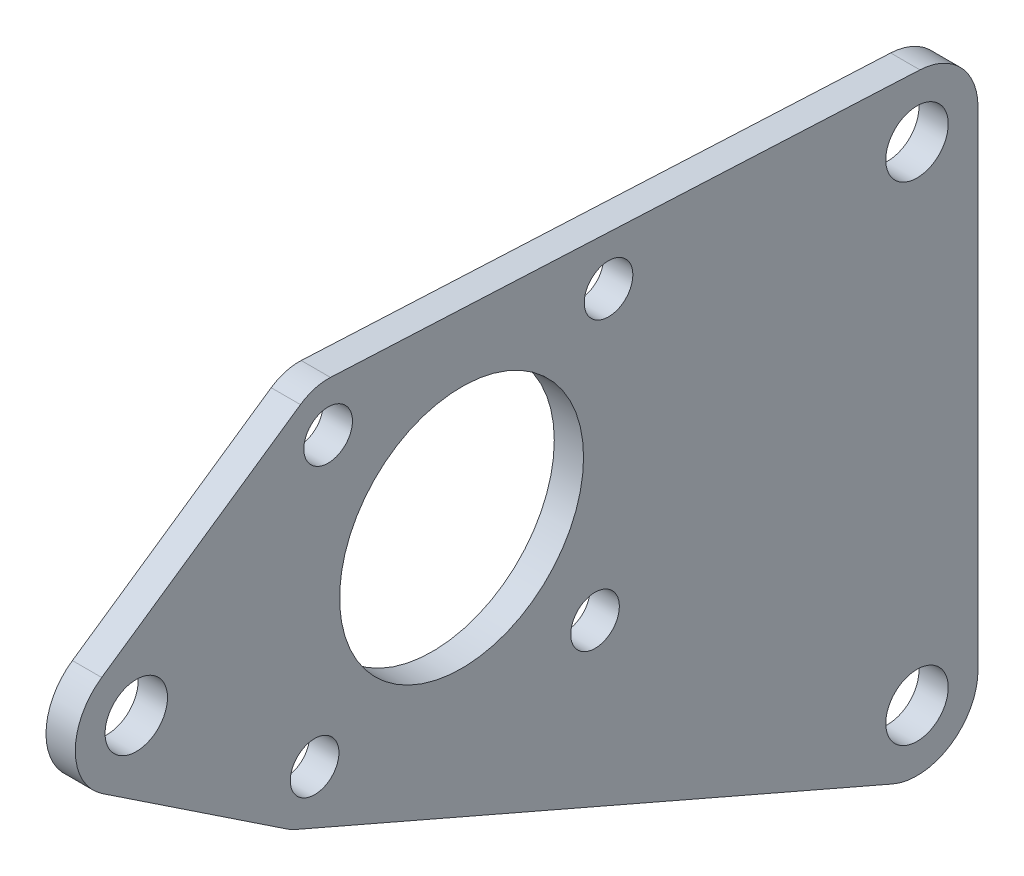
ISO-10303-21;
HEADER;
FILE_DESCRIPTION(('STEP AP214'),'2;1');
FILE_NAME('part.step','',(''),(''),'','','');
FILE_SCHEMA(('AUTOMOTIVE_DESIGN { 1 0 10303 214 1 1 1 1 }'));
ENDSEC;
DATA;
#1=APPLICATION_CONTEXT('core data for automotive mechanical design processes');
#2=APPLICATION_PROTOCOL_DEFINITION('international standard','automotive_design',2000,#1);
#3=PRODUCT_CONTEXT('',#1,'mechanical');
#4=PRODUCT('Part','Part','',(#3));
#5=PRODUCT_RELATED_PRODUCT_CATEGORY('part','',(#4));
#6=PRODUCT_DEFINITION_FORMATION('','',#4);
#7=PRODUCT_DEFINITION_CONTEXT('part definition',#1,'design');
#8=PRODUCT_DEFINITION('design','',#6,#7);
#9=PRODUCT_DEFINITION_SHAPE('','',#8);
#10=(LENGTH_UNIT() NAMED_UNIT(*) SI_UNIT(.MILLI.,.METRE.));
#11=(NAMED_UNIT(*) PLANE_ANGLE_UNIT() SI_UNIT($,.RADIAN.));
#12=(NAMED_UNIT(*) SI_UNIT($,.STERADIAN.) SOLID_ANGLE_UNIT());
#13=UNCERTAINTY_MEASURE_WITH_UNIT(LENGTH_MEASURE(1.E-05),#10,'distance_accuracy_value','');
#14=(GEOMETRIC_REPRESENTATION_CONTEXT(3) GLOBAL_UNCERTAINTY_ASSIGNED_CONTEXT((#13)) GLOBAL_UNIT_ASSIGNED_CONTEXT((#10,
#11,#12)) REPRESENTATION_CONTEXT('',''));
#15=CARTESIAN_POINT('',(0.,0.,0.));
#16=DIRECTION('',(0.,0.,1.));
#17=DIRECTION('',(1.,0.,0.));
#18=AXIS2_PLACEMENT_3D('',#15,#16,#17);
#19=CARTESIAN_POINT('',(-2.286,29.7942,60.96));
#20=DIRECTION('',(1.,0.,0.));
#21=DIRECTION('',(0.,0.,-1.));
#22=AXIS2_PLACEMENT_3D('',#19,#20,#21);
#23=CYLINDRICAL_SURFACE('',#22,4.7625);
#24=CARTESIAN_POINT('',(0.,29.7942,60.96));
#25=DIRECTION('',(1.,0.,0.));
#26=DIRECTION('',(0.,0.,1.));
#27=AXIS2_PLACEMENT_3D('',#24,#25,#26);
#28=CIRCLE('',#27,4.7625);
#29=CARTESIAN_POINT('',(0.,33.7163164389574,63.6615567529222));
#30=VERTEX_POINT('',#29);
#31=CARTESIAN_POINT('',(0.,25.8305154290424,63.6001914460797));
#32=VERTEX_POINT('',#31);
#33=EDGE_CURVE('E168',#30,#32,#28,.T.);
#34=ORIENTED_EDGE('',*,*,#33,.F.);
#35=DIRECTION('',(1.,0.,0.));
#36=VECTOR('',#35,1.);
#37=CARTESIAN_POINT('',(-2.286,33.7163164389574,63.6615567529222));
#38=LINE('',#37,#36);
#39=CARTESIAN_POINT('',(-2.286,33.7163164389574,63.6615567529222));
#40=VERTEX_POINT('',#39);
#41=EDGE_CURVE('E13',#40,#30,#38,.T.);
#42=ORIENTED_EDGE('',*,*,#41,.F.);
#43=CARTESIAN_POINT('',(-2.286,29.7942,60.96));
#44=DIRECTION('',(1.,0.,0.));
#45=DIRECTION('',(0.,0.,1.));
#46=AXIS2_PLACEMENT_3D('',#43,#44,#45);
#47=CIRCLE('',#46,4.7625);
#48=CARTESIAN_POINT('',(-2.286,25.8305154290424,63.6001914460797));
#49=VERTEX_POINT('',#48);
#50=EDGE_CURVE('E195',#40,#49,#47,.T.);
#51=ORIENTED_EDGE('',*,*,#50,.T.);
#52=DIRECTION('',(1.,0.,0.));
#53=VECTOR('',#52,1.);
#54=CARTESIAN_POINT('',(-2.286,25.8305154290424,63.6001914460797));
#55=LINE('',#54,#53);
#56=EDGE_CURVE('E59',#49,#32,#55,.T.);
#57=ORIENTED_EDGE('',*,*,#56,.T.);
#58=EDGE_LOOP('',(#34,#42,#51,#57));
#59=FACE_BOUND('',#58,.T.);
#60=ADVANCED_FACE('F56',(#59),#23,.T.);
#61=CARTESIAN_POINT('',(-2.286,33.7163164389574,63.6615567529222));
#62=DIRECTION('',(0.,0.823541509492378,0.56725601111228));
#63=DIRECTION('',(0.,-0.567256011112281,0.823541509492378));
#64=AXIS2_PLACEMENT_3D('',#61,#62,#63);
#65=PLANE('',#64);
#66=DIRECTION('',(0.,-0.56725601111228,0.823541509492378));
#67=VECTOR('',#66,1.);
#68=CARTESIAN_POINT('',(0.,33.7163164389574,63.6615567529222));
#69=LINE('',#68,#67);
#70=CARTESIAN_POINT('',(0.,44.4067780264744,48.1411590832863));
#71=VERTEX_POINT('',#70);
#72=EDGE_CURVE('E193',#71,#30,#69,.T.);
#73=ORIENTED_EDGE('',*,*,#72,.F.);
#74=DIRECTION('',(1.,0.,0.));
#75=VECTOR('',#74,1.);
#76=CARTESIAN_POINT('',(-2.286,44.4067780264744,48.1411590832863));
#77=LINE('',#76,#75);
#78=CARTESIAN_POINT('',(-2.286,44.4067780264744,48.1411590832863));
#79=VERTEX_POINT('',#78);
#80=EDGE_CURVE('E65',#79,#71,#77,.T.);
#81=ORIENTED_EDGE('',*,*,#80,.F.);
#82=DIRECTION('',(0.,-0.56725601111228,0.823541509492378));
#83=VECTOR('',#82,1.);
#84=CARTESIAN_POINT('',(-2.286,33.7163164389574,63.6615567529222));
#85=LINE('',#84,#83);
#86=EDGE_CURVE('E155',#79,#40,#85,.T.);
#87=ORIENTED_EDGE('',*,*,#86,.T.);
#88=ORIENTED_EDGE('',*,*,#41,.T.);
#89=EDGE_LOOP('',(#73,#81,#87,#88));
#90=FACE_BOUND('',#89,.T.);
#91=ADVANCED_FACE('F211',(#90),#65,.T.);
#92=CARTESIAN_POINT('',(-2.286,41.2690848753085,45.9799136809485));
#93=DIRECTION('',(1.,0.,0.));
#94=DIRECTION('',(0.,0.,-1.));
#95=AXIS2_PLACEMENT_3D('',#92,#93,#94);
#96=CYLINDRICAL_SURFACE('',#95,3.81000000000001);
#97=CARTESIAN_POINT('',(0.,41.2690848753085,45.9799136809485));
#98=DIRECTION('',(1.,0.,0.));
#99=DIRECTION('',(0.,0.,1.));
#100=AXIS2_PLACEMENT_3D('',#97,#98,#99);
#101=CIRCLE('',#100,3.81000000000001);
#102=CARTESIAN_POINT('',(0.,45.0746697923867,45.7965467294375));
#103=VERTEX_POINT('',#102);
#104=EDGE_CURVE('E142',#103,#71,#101,.T.);
#105=ORIENTED_EDGE('',*,*,#104,.F.);
#106=DIRECTION('',(1.,0.,0.));
#107=VECTOR('',#106,1.);
#108=CARTESIAN_POINT('',(-2.286,45.0746697923867,45.7965467294375));
#109=LINE('',#108,#107);
#110=CARTESIAN_POINT('',(-2.286,45.0746697923867,45.7965467294375));
#111=VERTEX_POINT('',#110);
#112=EDGE_CURVE('E137',#111,#103,#109,.T.);
#113=ORIENTED_EDGE('',*,*,#112,.F.);
#114=CARTESIAN_POINT('',(-2.286,41.2690848753085,45.9799136809485));
#115=DIRECTION('',(1.,0.,0.));
#116=DIRECTION('',(0.,0.,1.));
#117=AXIS2_PLACEMENT_3D('',#114,#115,#116);
#118=CIRCLE('',#117,3.81000000000001);
#119=EDGE_CURVE('E140',#111,#79,#118,.T.);
#120=ORIENTED_EDGE('',*,*,#119,.T.);
#121=ORIENTED_EDGE('',*,*,#80,.T.);
#122=EDGE_LOOP('',(#105,#113,#120,#121));
#123=FACE_BOUND('',#122,.T.);
#124=ADVANCED_FACE('F139',(#123),#96,.T.);
#125=CARTESIAN_POINT('',(-2.286,45.0746697923867,45.7965467294375));
#126=DIRECTION('',(0.,0.998841185584846,-0.0481278087955397));
#127=DIRECTION('',(0.,0.0481278087955397,0.998841185584846));
#128=AXIS2_PLACEMENT_3D('',#125,#126,#127);
#129=PLANE('',#128);
#130=DIRECTION('',(0.,0.0481278087955397,0.998841185584846));
#131=VECTOR('',#130,1.);
#132=CARTESIAN_POINT('',(0.,45.0746697923867,45.7965467294375));
#133=LINE('',#132,#131);
#134=CARTESIAN_POINT('',(0.,42.8569811463478,-0.229208689388757));
#135=VERTEX_POINT('',#134);
#136=EDGE_CURVE('E190',#135,#103,#133,.T.);
#137=ORIENTED_EDGE('',*,*,#136,.F.);
#138=DIRECTION('',(1.,0.,0.));
#139=VECTOR('',#138,1.);
#140=CARTESIAN_POINT('',(-2.286,42.8569811463478,-0.229208689388757));
#141=LINE('',#140,#139);
#142=CARTESIAN_POINT('',(-2.286,42.8569811463478,-0.229208689388757));
#143=VERTEX_POINT('',#142);
#144=EDGE_CURVE('E147',#143,#135,#141,.T.);
#145=ORIENTED_EDGE('',*,*,#144,.F.);
#146=DIRECTION('',(0.,0.0481278087955397,0.998841185584846));
#147=VECTOR('',#146,1.);
#148=CARTESIAN_POINT('',(-2.286,45.0746697923867,45.7965467294375));
#149=LINE('',#148,#147);
#150=EDGE_CURVE('E153',#143,#111,#149,.T.);
#151=ORIENTED_EDGE('',*,*,#150,.T.);
#152=ORIENTED_EDGE('',*,*,#112,.T.);
#153=EDGE_LOOP('',(#137,#145,#151,#152));
#154=FACE_BOUND('',#153,.T.);
#155=ADVANCED_FACE('F158',(#154),#129,.T.);
#156=CARTESIAN_POINT('',(-2.286,38.1,0.));
#157=DIRECTION('',(1.,0.,0.));
#158=DIRECTION('',(0.,0.,-1.));
#159=AXIS2_PLACEMENT_3D('',#156,#157,#158);
#160=CYLINDRICAL_SURFACE('',#159,4.7625);
#161=CARTESIAN_POINT('',(0.,38.1,0.));
#162=DIRECTION('',(1.,0.,0.));
#163=DIRECTION('',(0.,0.,1.));
#164=AXIS2_PLACEMENT_3D('',#161,#162,#163);
#165=CIRCLE('',#164,4.7625);
#166=CARTESIAN_POINT('',(0.,38.1,-4.7625));
#167=VERTEX_POINT('',#166);
#168=EDGE_CURVE('E187',#167,#135,#165,.T.);
#169=ORIENTED_EDGE('',*,*,#168,.F.);
#170=DIRECTION('',(1.,0.,0.));
#171=VECTOR('',#170,1.);
#172=CARTESIAN_POINT('',(-2.286,38.1,-4.7625));
#173=LINE('',#172,#171);
#174=CARTESIAN_POINT('',(-2.286,38.1,-4.7625));
#175=VERTEX_POINT('',#174);
#176=EDGE_CURVE('E199',#175,#167,#173,.T.);
#177=ORIENTED_EDGE('',*,*,#176,.F.);
#178=CARTESIAN_POINT('',(-2.286,38.1,0.));
#179=DIRECTION('',(1.,0.,0.));
#180=DIRECTION('',(0.,0.,1.));
#181=AXIS2_PLACEMENT_3D('',#178,#179,#180);
#182=CIRCLE('',#181,4.7625);
#183=EDGE_CURVE('E160',#175,#143,#182,.T.);
#184=ORIENTED_EDGE('',*,*,#183,.T.);
#185=ORIENTED_EDGE('',*,*,#144,.T.);
#186=EDGE_LOOP('',(#169,#177,#184,#185));
#187=FACE_BOUND('',#186,.T.);
#188=ADVANCED_FACE('F224',(#187),#160,.T.);
#189=CARTESIAN_POINT('',(-2.286,38.1,-4.7625));
#190=DIRECTION('',(0.,0.,-1.));
#191=DIRECTION('',(0.,1.,0.));
#192=AXIS2_PLACEMENT_3D('',#189,#190,#191);
#193=PLANE('',#192);
#194=DIRECTION('',(0.,1.,0.));
#195=VECTOR('',#194,1.);
#196=CARTESIAN_POINT('',(0.,38.1,-4.7625));
#197=LINE('',#196,#195);
#198=CARTESIAN_POINT('',(0.,0.,-4.7625));
#199=VERTEX_POINT('',#198);
#200=EDGE_CURVE('E184',#199,#167,#197,.T.);
#201=ORIENTED_EDGE('',*,*,#200,.F.);
#202=DIRECTION('',(1.,0.,0.));
#203=VECTOR('',#202,1.);
#204=CARTESIAN_POINT('',(-2.286,0.,-4.7625));
#205=LINE('',#204,#203);
#206=CARTESIAN_POINT('',(-2.286,0.,-4.7625));
#207=VERTEX_POINT('',#206);
#208=EDGE_CURVE('E201',#207,#199,#205,.T.);
#209=ORIENTED_EDGE('',*,*,#208,.F.);
#210=DIRECTION('',(0.,1.,0.));
#211=VECTOR('',#210,1.);
#212=CARTESIAN_POINT('',(-2.286,38.1,-4.7625));
#213=LINE('',#212,#211);
#214=EDGE_CURVE('E163',#207,#175,#213,.T.);
#215=ORIENTED_EDGE('',*,*,#214,.T.);
#216=ORIENTED_EDGE('',*,*,#176,.T.);
#217=EDGE_LOOP('',(#201,#209,#215,#216));
#218=FACE_BOUND('',#217,.T.);
#219=ADVANCED_FACE('F227',(#218),#193,.T.);
#220=CARTESIAN_POINT('',(-2.286,0.,0.));
#221=DIRECTION('',(1.,0.,0.));
#222=DIRECTION('',(0.,0.,-1.));
#223=AXIS2_PLACEMENT_3D('',#220,#221,#222);
#224=CYLINDRICAL_SURFACE('',#223,4.7625);
#225=CARTESIAN_POINT('',(0.,0.,0.));
#226=DIRECTION('',(1.,0.,0.));
#227=DIRECTION('',(0.,0.,1.));
#228=AXIS2_PLACEMENT_3D('',#225,#226,#227);
#229=CIRCLE('',#228,4.7625);
#230=CARTESIAN_POINT('',(0.,-4.36881308382901,1.8960164789802));
#231=VERTEX_POINT('',#230);
#232=EDGE_CURVE('E181',#231,#199,#229,.T.);
#233=ORIENTED_EDGE('',*,*,#232,.F.);
#234=DIRECTION('',(1.,0.,0.));
#235=VECTOR('',#234,1.);
#236=CARTESIAN_POINT('',(-2.286,-4.36881308382901,1.8960164789802));
#237=LINE('',#236,#235);
#238=CARTESIAN_POINT('',(-2.286,-4.36881308382901,1.8960164789802));
#239=VERTEX_POINT('',#238);
#240=EDGE_CURVE('E203',#239,#231,#237,.T.);
#241=ORIENTED_EDGE('',*,*,#240,.F.);
#242=CARTESIAN_POINT('',(-2.286,0.,0.));
#243=DIRECTION('',(1.,0.,0.));
#244=DIRECTION('',(0.,0.,1.));
#245=AXIS2_PLACEMENT_3D('',#242,#243,#244);
#246=CIRCLE('',#245,4.7625);
#247=EDGE_CURVE('E351',#239,#207,#246,.T.);
#248=ORIENTED_EDGE('',*,*,#247,.T.);
#249=ORIENTED_EDGE('',*,*,#208,.T.);
#250=EDGE_LOOP('',(#233,#241,#248,#249));
#251=FACE_BOUND('',#250,.T.);
#252=ADVANCED_FACE('F231',(#251),#224,.T.);
#253=CARTESIAN_POINT('',(-2.286,15.8792358519883,48.5516980584926));
#254=DIRECTION('',(0.,-0.917336080594017,0.398113696373796));
#255=DIRECTION('',(0.,-0.398113696373796,-0.917336080594017));
#256=AXIS2_PLACEMENT_3D('',#253,#254,#255);
#257=PLANE('',#256);
#258=DIRECTION('',(0.,-0.398113696373796,-0.917336080594017));
#259=VECTOR('',#258,1.);
#260=CARTESIAN_POINT('',(0.,15.8792358519883,48.5516980584926));
#261=LINE('',#260,#259);
#262=CARTESIAN_POINT('',(0.,15.8792358519883,48.5516980584926));
#263=VERTEX_POINT('',#262);
#264=EDGE_CURVE('E178',#263,#231,#261,.T.);
#265=ORIENTED_EDGE('',*,*,#264,.F.);
#266=DIRECTION('',(1.,0.,0.));
#267=VECTOR('',#266,1.);
#268=CARTESIAN_POINT('',(-2.286,15.8792358519883,48.5516980584926));
#269=LINE('',#268,#267);
#270=CARTESIAN_POINT('',(-2.286,15.8792358519883,48.5516980584926));
#271=VERTEX_POINT('',#270);
#272=EDGE_CURVE('E205',#271,#263,#269,.T.);
#273=ORIENTED_EDGE('',*,*,#272,.F.);
#274=DIRECTION('',(0.,-0.398113696373796,-0.917336080594017));
#275=VECTOR('',#274,1.);
#276=CARTESIAN_POINT('',(-2.286,15.8792358519883,48.5516980584926));
#277=LINE('',#276,#275);
#278=EDGE_CURVE('E347',#271,#239,#277,.T.);
#279=ORIENTED_EDGE('',*,*,#278,.T.);
#280=ORIENTED_EDGE('',*,*,#240,.T.);
#281=EDGE_LOOP('',(#265,#273,#279,#280));
#282=FACE_BOUND('',#281,.T.);
#283=ADVANCED_FACE('F235',(#282),#257,.T.);
#284=CARTESIAN_POINT('',(-2.286,19.3742863190515,47.0348848753085));
#285=DIRECTION('',(1.,0.,0.));
#286=DIRECTION('',(0.,0.,-1.));
#287=AXIS2_PLACEMENT_3D('',#284,#285,#286);
#288=CYLINDRICAL_SURFACE('',#287,3.81);
#289=CARTESIAN_POINT('',(0.,19.3742863190515,47.0348848753085));
#290=DIRECTION('',(1.,0.,0.));
#291=DIRECTION('',(0.,0.,-1.));
#292=AXIS2_PLACEMENT_3D('',#289,#290,#291);
#293=CIRCLE('',#292,3.81);
#294=CARTESIAN_POINT('',(0.,16.2033386622854,49.1470380321722));
#295=VERTEX_POINT('',#294);
#296=EDGE_CURVE('E175',#295,#263,#293,.T.);
#297=ORIENTED_EDGE('',*,*,#296,.F.);
#298=DIRECTION('',(1.,0.,0.));
#299=VECTOR('',#298,1.);
#300=CARTESIAN_POINT('',(-2.286,16.2033386622854,49.1470380321722));
#301=LINE('',#300,#299);
#302=CARTESIAN_POINT('',(-2.286,16.2033386622854,49.1470380321722));
#303=VERTEX_POINT('',#302);
#304=EDGE_CURVE('E206',#303,#295,#301,.T.);
#305=ORIENTED_EDGE('',*,*,#304,.F.);
#306=CARTESIAN_POINT('',(-2.286,19.3742863190515,47.0348848753085));
#307=DIRECTION('',(1.,0.,0.));
#308=DIRECTION('',(0.,0.,-1.));
#309=AXIS2_PLACEMENT_3D('',#306,#307,#308);
#310=CIRCLE('',#309,3.81);
#311=EDGE_CURVE('E343',#303,#271,#310,.T.);
#312=ORIENTED_EDGE('',*,*,#311,.T.);
#313=ORIENTED_EDGE('',*,*,#272,.T.);
#314=EDGE_LOOP('',(#297,#305,#312,#313));
#315=FACE_BOUND('',#314,.T.);
#316=ADVANCED_FACE('F239',(#315),#288,.T.);
#317=CARTESIAN_POINT('',(-2.286,25.8305154290424,63.6001914460797));
#318=DIRECTION('',(0.,-0.832269726185328,0.554370907313325));
#319=DIRECTION('',(0.,-0.554370907313325,-0.832269726185328));
#320=AXIS2_PLACEMENT_3D('',#317,#318,#319);
#321=PLANE('',#320);
#322=DIRECTION('',(0.,-0.554370907313325,-0.832269726185328));
#323=VECTOR('',#322,1.);
#324=CARTESIAN_POINT('',(0.,25.8305154290424,63.6001914460797));
#325=LINE('',#324,#323);
#326=EDGE_CURVE('E171',#32,#295,#325,.T.);
#327=ORIENTED_EDGE('',*,*,#326,.F.);
#328=ORIENTED_EDGE('',*,*,#56,.F.);
#329=DIRECTION('',(0.,-0.554370907313325,-0.832269726185328));
#330=VECTOR('',#329,1.);
#331=CARTESIAN_POINT('',(-2.286,25.8305154290424,63.6001914460797));
#332=LINE('',#331,#330);
#333=EDGE_CURVE('E340',#49,#303,#332,.T.);
#334=ORIENTED_EDGE('',*,*,#333,.T.);
#335=ORIENTED_EDGE('',*,*,#304,.T.);
#336=EDGE_LOOP('',(#327,#328,#334,#335));
#337=FACE_BOUND('',#336,.T.);
#338=ADVANCED_FACE('F208',(#337),#321,.T.);
#339=CARTESIAN_POINT('',(-2.286,29.7942,60.96));
#340=DIRECTION('',(-1.,0.,0.));
#341=DIRECTION('',(0.,0.,1.));
#342=AXIS2_PLACEMENT_3D('',#339,#340,#341);
#343=PLANE('',#342);
#344=CARTESIAN_POINT('',(-2.286,40.2141136809485,24.0851151246915));
#345=DIRECTION('',(1.,0.,0.));
#346=DIRECTION('',(0.,0.,-1.));
#347=AXIS2_PLACEMENT_3D('',#344,#345,#346);
#348=CIRCLE('',#347,1.89865);
#349=CARTESIAN_POINT('',(-2.286,40.2141136809485,22.1864651246915));
#350=VERTEX_POINT('',#349);
#351=EDGE_CURVE('E290',#350,#350,#348,.T.);
#352=ORIENTED_EDGE('',*,*,#351,.T.);
#353=EDGE_LOOP('',(#352));
#354=FACE_BOUND('',#353,.T.);
#355=CARTESIAN_POINT('',(-2.286,41.2690848753085,45.9799136809485));
#356=DIRECTION('',(1.,0.,0.));
#357=DIRECTION('',(0.,0.,-1.));
#358=AXIS2_PLACEMENT_3D('',#355,#356,#357);
#359=CIRCLE('',#358,1.89865);
#360=CARTESIAN_POINT('',(-2.286,41.2690848753085,44.0812636809485));
#361=VERTEX_POINT('',#360);
#362=EDGE_CURVE('E300',#361,#361,#359,.T.);
#363=ORIENTED_EDGE('',*,*,#362,.T.);
#364=EDGE_LOOP('',(#363));
#365=FACE_BOUND('',#364,.T.);
#366=CARTESIAN_POINT('',(-2.286,18.3193151246915,25.1400863190515));
#367=DIRECTION('',(1.,0.,0.));
#368=DIRECTION('',(0.,0.,-1.));
#369=AXIS2_PLACEMENT_3D('',#366,#367,#368);
#370=CIRCLE('',#369,1.89865);
#371=CARTESIAN_POINT('',(-2.286,18.3193151246915,23.2414363190515));
#372=VERTEX_POINT('',#371);
#373=EDGE_CURVE('E306',#372,#372,#370,.T.);
#374=ORIENTED_EDGE('',*,*,#373,.T.);
#375=EDGE_LOOP('',(#374));
#376=FACE_BOUND('',#375,.T.);
#377=CARTESIAN_POINT('',(-2.286,19.3742863190515,47.0348848753085));
#378=DIRECTION('',(1.,0.,0.));
#379=DIRECTION('',(0.,0.,-1.));
#380=AXIS2_PLACEMENT_3D('',#377,#378,#379);
#381=CIRCLE('',#380,1.89865);
#382=CARTESIAN_POINT('',(-2.286,19.3742863190515,45.1362348753085));
#383=VERTEX_POINT('',#382);
#384=EDGE_CURVE('E312',#383,#383,#381,.T.);
#385=ORIENTED_EDGE('',*,*,#384,.T.);
#386=EDGE_LOOP('',(#385));
#387=FACE_BOUND('',#386,.T.);
#388=CARTESIAN_POINT('',(-2.286,29.7942,35.56));
#389=DIRECTION('',(1.,0.,0.));
#390=DIRECTION('',(0.,0.,-1.));
#391=AXIS2_PLACEMENT_3D('',#388,#389,#390);
#392=CIRCLE('',#391,9.525);
#393=CARTESIAN_POINT('',(-2.286,29.7942,26.035));
#394=VERTEX_POINT('',#393);
#395=EDGE_CURVE('E316',#394,#394,#392,.T.);
#396=ORIENTED_EDGE('',*,*,#395,.T.);
#397=EDGE_LOOP('',(#396));
#398=FACE_BOUND('',#397,.T.);
#399=CARTESIAN_POINT('',(-2.286,29.7942,60.96));
#400=DIRECTION('',(1.,0.,0.));
#401=DIRECTION('',(0.,0.,-1.));
#402=AXIS2_PLACEMENT_3D('',#399,#400,#401);
#403=CIRCLE('',#402,2.43839999999998);
#404=CARTESIAN_POINT('',(-2.286,29.7942,58.5216));
#405=VERTEX_POINT('',#404);
#406=EDGE_CURVE('E323',#405,#405,#403,.T.);
#407=ORIENTED_EDGE('',*,*,#406,.T.);
#408=EDGE_LOOP('',(#407));
#409=FACE_BOUND('',#408,.T.);
#410=CARTESIAN_POINT('',(-2.286,0.,0.));
#411=DIRECTION('',(1.,0.,0.));
#412=DIRECTION('',(0.,0.,-1.));
#413=AXIS2_PLACEMENT_3D('',#410,#411,#412);
#414=CIRCLE('',#413,2.4384);
#415=CARTESIAN_POINT('',(-2.286,0.,-2.4384));
#416=VERTEX_POINT('',#415);
#417=EDGE_CURVE('E329',#416,#416,#414,.T.);
#418=ORIENTED_EDGE('',*,*,#417,.T.);
#419=EDGE_LOOP('',(#418));
#420=FACE_BOUND('',#419,.T.);
#421=CARTESIAN_POINT('',(-2.286,38.1,0.));
#422=DIRECTION('',(1.,0.,0.));
#423=DIRECTION('',(0.,0.,-1.));
#424=AXIS2_PLACEMENT_3D('',#421,#422,#423);
#425=CIRCLE('',#424,2.4384);
#426=CARTESIAN_POINT('',(-2.286,38.1,-2.4384));
#427=VERTEX_POINT('',#426);
#428=EDGE_CURVE('E172',#427,#427,#425,.T.);
#429=ORIENTED_EDGE('',*,*,#428,.T.);
#430=EDGE_LOOP('',(#429));
#431=FACE_BOUND('',#430,.T.);
#432=ORIENTED_EDGE('',*,*,#50,.F.);
#433=ORIENTED_EDGE('',*,*,#86,.F.);
#434=ORIENTED_EDGE('',*,*,#119,.F.);
#435=ORIENTED_EDGE('',*,*,#150,.F.);
#436=ORIENTED_EDGE('',*,*,#183,.F.);
#437=ORIENTED_EDGE('',*,*,#214,.F.);
#438=ORIENTED_EDGE('',*,*,#247,.F.);
#439=ORIENTED_EDGE('',*,*,#278,.F.);
#440=ORIENTED_EDGE('',*,*,#311,.F.);
#441=ORIENTED_EDGE('',*,*,#333,.F.);
#442=EDGE_LOOP('',(#432,#433,#434,#435,#436,#437,#438,#439,#440,#441));
#443=FACE_BOUND('',#442,.T.);
#444=ADVANCED_FACE('F151',(#354,#365,#376,#387,#398,#409,#420,#431,#443),#343,.T.);
#445=CARTESIAN_POINT('',(0.,29.7942,60.96));
#446=DIRECTION('',(-1.,0.,0.));
#447=DIRECTION('',(0.,0.,1.));
#448=AXIS2_PLACEMENT_3D('',#445,#446,#447);
#449=PLANE('',#448);
#450=CARTESIAN_POINT('',(0.,40.2141136809485,24.0851151246915));
#451=DIRECTION('',(1.,0.,0.));
#452=DIRECTION('',(0.,0.,-1.));
#453=AXIS2_PLACEMENT_3D('',#450,#451,#452);
#454=CIRCLE('',#453,1.89865);
#455=CARTESIAN_POINT('',(0.,40.2141136809485,22.1864651246915));
#456=VERTEX_POINT('',#455);
#457=EDGE_CURVE('E293',#456,#456,#454,.T.);
#458=ORIENTED_EDGE('',*,*,#457,.F.);
#459=EDGE_LOOP('',(#458));
#460=FACE_BOUND('',#459,.T.);
#461=CARTESIAN_POINT('',(0.,41.2690848753085,45.9799136809485));
#462=DIRECTION('',(1.,0.,0.));
#463=DIRECTION('',(0.,0.,-1.));
#464=AXIS2_PLACEMENT_3D('',#461,#462,#463);
#465=CIRCLE('',#464,1.89865);
#466=CARTESIAN_POINT('',(0.,41.2690848753085,44.0812636809485));
#467=VERTEX_POINT('',#466);
#468=EDGE_CURVE('E295',#467,#467,#465,.T.);
#469=ORIENTED_EDGE('',*,*,#468,.F.);
#470=EDGE_LOOP('',(#469));
#471=FACE_BOUND('',#470,.T.);
#472=CARTESIAN_POINT('',(0.,18.3193151246915,25.1400863190515));
#473=DIRECTION('',(1.,0.,0.));
#474=DIRECTION('',(0.,0.,-1.));
#475=AXIS2_PLACEMENT_3D('',#472,#473,#474);
#476=CIRCLE('',#475,1.89865);
#477=CARTESIAN_POINT('',(0.,18.3193151246915,23.2414363190515));
#478=VERTEX_POINT('',#477);
#479=EDGE_CURVE('E303',#478,#478,#476,.T.);
#480=ORIENTED_EDGE('',*,*,#479,.F.);
#481=EDGE_LOOP('',(#480));
#482=FACE_BOUND('',#481,.T.);
#483=CARTESIAN_POINT('',(0.,19.3742863190515,47.0348848753085));
#484=DIRECTION('',(1.,0.,0.));
#485=DIRECTION('',(0.,0.,-1.));
#486=AXIS2_PLACEMENT_3D('',#483,#484,#485);
#487=CIRCLE('',#486,1.89865);
#488=CARTESIAN_POINT('',(0.,19.3742863190515,45.1362348753085));
#489=VERTEX_POINT('',#488);
#490=EDGE_CURVE('E309',#489,#489,#487,.T.);
#491=ORIENTED_EDGE('',*,*,#490,.F.);
#492=EDGE_LOOP('',(#491));
#493=FACE_BOUND('',#492,.T.);
#494=CARTESIAN_POINT('',(0.,29.7942,35.56));
#495=DIRECTION('',(1.,0.,0.));
#496=DIRECTION('',(0.,0.,-1.));
#497=AXIS2_PLACEMENT_3D('',#494,#495,#496);
#498=CIRCLE('',#497,9.525);
#499=CARTESIAN_POINT('',(0.,29.7942,26.035));
#500=VERTEX_POINT('',#499);
#501=EDGE_CURVE('E315',#500,#500,#498,.T.);
#502=ORIENTED_EDGE('',*,*,#501,.F.);
#503=EDGE_LOOP('',(#502));
#504=FACE_BOUND('',#503,.T.);
#505=CARTESIAN_POINT('',(0.,29.7942,60.96));
#506=DIRECTION('',(1.,0.,0.));
#507=DIRECTION('',(0.,0.,-1.));
#508=AXIS2_PLACEMENT_3D('',#505,#506,#507);
#509=CIRCLE('',#508,2.43839999999998);
#510=CARTESIAN_POINT('',(0.,29.7942,58.5216));
#511=VERTEX_POINT('',#510);
#512=EDGE_CURVE('E319',#511,#511,#509,.T.);
#513=ORIENTED_EDGE('',*,*,#512,.F.);
#514=EDGE_LOOP('',(#513));
#515=FACE_BOUND('',#514,.T.);
#516=CARTESIAN_POINT('',(0.,0.,0.));
#517=DIRECTION('',(1.,0.,0.));
#518=DIRECTION('',(0.,0.,-1.));
#519=AXIS2_PLACEMENT_3D('',#516,#517,#518);
#520=CIRCLE('',#519,2.4384);
#521=CARTESIAN_POINT('',(0.,0.,-2.4384));
#522=VERTEX_POINT('',#521);
#523=EDGE_CURVE('E326',#522,#522,#520,.T.);
#524=ORIENTED_EDGE('',*,*,#523,.F.);
#525=EDGE_LOOP('',(#524));
#526=FACE_BOUND('',#525,.T.);
#527=CARTESIAN_POINT('',(0.,38.1,0.));
#528=DIRECTION('',(1.,0.,0.));
#529=DIRECTION('',(0.,0.,-1.));
#530=AXIS2_PLACEMENT_3D('',#527,#528,#529);
#531=CIRCLE('',#530,2.4384);
#532=CARTESIAN_POINT('',(0.,38.1,-2.4384));
#533=VERTEX_POINT('',#532);
#534=EDGE_CURVE('E332',#533,#533,#531,.T.);
#535=ORIENTED_EDGE('',*,*,#534,.F.);
#536=EDGE_LOOP('',(#535));
#537=FACE_BOUND('',#536,.T.);
#538=ORIENTED_EDGE('',*,*,#33,.T.);
#539=ORIENTED_EDGE('',*,*,#326,.T.);
#540=ORIENTED_EDGE('',*,*,#296,.T.);
#541=ORIENTED_EDGE('',*,*,#264,.T.);
#542=ORIENTED_EDGE('',*,*,#232,.T.);
#543=ORIENTED_EDGE('',*,*,#200,.T.);
#544=ORIENTED_EDGE('',*,*,#168,.T.);
#545=ORIENTED_EDGE('',*,*,#136,.T.);
#546=ORIENTED_EDGE('',*,*,#104,.T.);
#547=ORIENTED_EDGE('',*,*,#72,.T.);
#548=EDGE_LOOP('',(#538,#539,#540,#541,#542,#543,#544,#545,#546,#547));
#549=FACE_BOUND('',#548,.T.);
#550=ADVANCED_FACE('F210',(#460,#471,#482,#493,#504,#515,#526,#537,#549),#449,.F.);
#551=CARTESIAN_POINT('',(-2.286,38.1,0.));
#552=DIRECTION('',(1.,0.,0.));
#553=DIRECTION('',(0.,0.,-1.));
#554=AXIS2_PLACEMENT_3D('',#551,#552,#553);
#555=CYLINDRICAL_SURFACE('',#554,2.4384);
#556=ORIENTED_EDGE('',*,*,#428,.F.);
#557=EDGE_LOOP('',(#556));
#558=FACE_BOUND('',#557,.T.);
#559=ORIENTED_EDGE('',*,*,#534,.T.);
#560=EDGE_LOOP('',(#559));
#561=FACE_BOUND('',#560,.T.);
#562=ADVANCED_FACE('F251',(#558,#561),#555,.F.);
#563=CARTESIAN_POINT('',(-2.286,0.,0.));
#564=DIRECTION('',(1.,0.,0.));
#565=DIRECTION('',(0.,0.,-1.));
#566=AXIS2_PLACEMENT_3D('',#563,#564,#565);
#567=CYLINDRICAL_SURFACE('',#566,2.4384);
#568=ORIENTED_EDGE('',*,*,#417,.F.);
#569=EDGE_LOOP('',(#568));
#570=FACE_BOUND('',#569,.T.);
#571=ORIENTED_EDGE('',*,*,#523,.T.);
#572=EDGE_LOOP('',(#571));
#573=FACE_BOUND('',#572,.T.);
#574=ADVANCED_FACE('F258',(#570,#573),#567,.F.);
#575=CARTESIAN_POINT('',(-2.286,29.7942,60.96));
#576=DIRECTION('',(1.,0.,0.));
#577=DIRECTION('',(0.,0.,-1.));
#578=AXIS2_PLACEMENT_3D('',#575,#576,#577);
#579=CYLINDRICAL_SURFACE('',#578,2.43839999999998);
#580=ORIENTED_EDGE('',*,*,#406,.F.);
#581=EDGE_LOOP('',(#580));
#582=FACE_BOUND('',#581,.T.);
#583=ORIENTED_EDGE('',*,*,#512,.T.);
#584=EDGE_LOOP('',(#583));
#585=FACE_BOUND('',#584,.T.);
#586=ADVANCED_FACE('F262',(#582,#585),#579,.F.);
#587=CARTESIAN_POINT('',(-2.286,29.7942,35.56));
#588=DIRECTION('',(1.,0.,0.));
#589=DIRECTION('',(0.,0.,-1.));
#590=AXIS2_PLACEMENT_3D('',#587,#588,#589);
#591=CYLINDRICAL_SURFACE('',#590,9.525);
#592=ORIENTED_EDGE('',*,*,#395,.F.);
#593=EDGE_LOOP('',(#592));
#594=FACE_BOUND('',#593,.T.);
#595=ORIENTED_EDGE('',*,*,#501,.T.);
#596=EDGE_LOOP('',(#595));
#597=FACE_BOUND('',#596,.T.);
#598=ADVANCED_FACE('F266',(#594,#597),#591,.F.);
#599=CARTESIAN_POINT('',(0.,19.3742863190515,47.0348848753085));
#600=DIRECTION('',(1.,0.,0.));
#601=DIRECTION('',(0.,0.,-1.));
#602=AXIS2_PLACEMENT_3D('',#599,#600,#601);
#603=CYLINDRICAL_SURFACE('',#602,1.89865);
#604=ORIENTED_EDGE('',*,*,#384,.F.);
#605=EDGE_LOOP('',(#604));
#606=FACE_BOUND('',#605,.T.);
#607=ORIENTED_EDGE('',*,*,#490,.T.);
#608=EDGE_LOOP('',(#607));
#609=FACE_BOUND('',#608,.T.);
#610=ADVANCED_FACE('F270',(#606,#609),#603,.F.);
#611=CARTESIAN_POINT('',(0.,18.3193151246915,25.1400863190515));
#612=DIRECTION('',(1.,0.,0.));
#613=DIRECTION('',(0.,0.,-1.));
#614=AXIS2_PLACEMENT_3D('',#611,#612,#613);
#615=CYLINDRICAL_SURFACE('',#614,1.89865);
#616=ORIENTED_EDGE('',*,*,#373,.F.);
#617=EDGE_LOOP('',(#616));
#618=FACE_BOUND('',#617,.T.);
#619=ORIENTED_EDGE('',*,*,#479,.T.);
#620=EDGE_LOOP('',(#619));
#621=FACE_BOUND('',#620,.T.);
#622=ADVANCED_FACE('F274',(#618,#621),#615,.F.);
#623=CARTESIAN_POINT('',(0.,41.2690848753085,45.9799136809485));
#624=DIRECTION('',(1.,0.,0.));
#625=DIRECTION('',(0.,0.,-1.));
#626=AXIS2_PLACEMENT_3D('',#623,#624,#625);
#627=CYLINDRICAL_SURFACE('',#626,1.89865);
#628=ORIENTED_EDGE('',*,*,#362,.F.);
#629=EDGE_LOOP('',(#628));
#630=FACE_BOUND('',#629,.T.);
#631=ORIENTED_EDGE('',*,*,#468,.T.);
#632=EDGE_LOOP('',(#631));
#633=FACE_BOUND('',#632,.T.);
#634=ADVANCED_FACE('F278',(#630,#633),#627,.F.);
#635=CARTESIAN_POINT('',(0.,40.2141136809485,24.0851151246915));
#636=DIRECTION('',(1.,0.,0.));
#637=DIRECTION('',(0.,0.,-1.));
#638=AXIS2_PLACEMENT_3D('',#635,#636,#637);
#639=CYLINDRICAL_SURFACE('',#638,1.89865);
#640=ORIENTED_EDGE('',*,*,#351,.F.);
#641=EDGE_LOOP('',(#640));
#642=FACE_BOUND('',#641,.T.);
#643=ORIENTED_EDGE('',*,*,#457,.T.);
#644=EDGE_LOOP('',(#643));
#645=FACE_BOUND('',#644,.T.);
#646=ADVANCED_FACE('F282',(#642,#645),#639,.F.);
#647=CLOSED_SHELL('',(#60,#91,#124,#155,#188,#219,#252,#283,#316,#338,#444,#550,#562,#574,#586,
#598,#610,#622,#634,#646));
#648=MANIFOLD_SOLID_BREP('B2',#647);
#649=ADVANCED_BREP_SHAPE_REPRESENTATION('',(#18,#648),#14);
#650=SHAPE_DEFINITION_REPRESENTATION(#9,#649);
ENDSEC;
END-ISO-10303-21;
